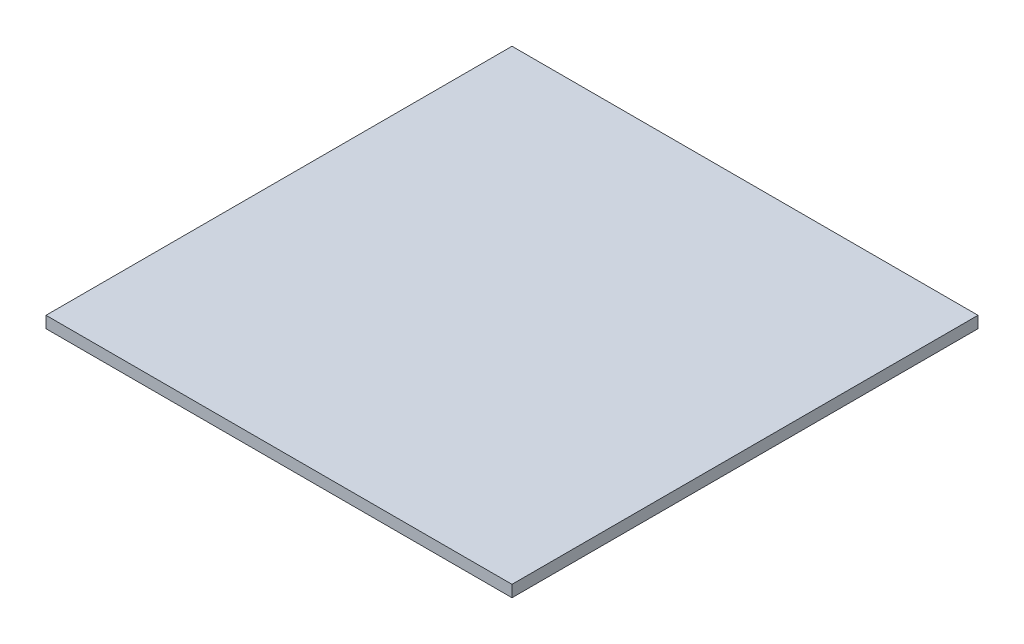
ISO-10303-21;
HEADER;
FILE_DESCRIPTION(('STEP AP214'),'2;1');
FILE_NAME('part.step','',(''),(''),'','','');
FILE_SCHEMA(('AUTOMOTIVE_DESIGN { 1 0 10303 214 1 1 1 1 }'));
ENDSEC;
DATA;
#1=APPLICATION_CONTEXT('core data for automotive mechanical design processes');
#2=APPLICATION_PROTOCOL_DEFINITION('international standard','automotive_design',2000,#1);
#3=PRODUCT_CONTEXT('',#1,'mechanical');
#4=PRODUCT('Part','Part','',(#3));
#5=PRODUCT_RELATED_PRODUCT_CATEGORY('part','',(#4));
#6=PRODUCT_DEFINITION_FORMATION('','',#4);
#7=PRODUCT_DEFINITION_CONTEXT('part definition',#1,'design');
#8=PRODUCT_DEFINITION('design','',#6,#7);
#9=PRODUCT_DEFINITION_SHAPE('','',#8);
#10=(LENGTH_UNIT() NAMED_UNIT(*) SI_UNIT(.MILLI.,.METRE.));
#11=(NAMED_UNIT(*) PLANE_ANGLE_UNIT() SI_UNIT($,.RADIAN.));
#12=(NAMED_UNIT(*) SI_UNIT($,.STERADIAN.) SOLID_ANGLE_UNIT());
#13=UNCERTAINTY_MEASURE_WITH_UNIT(LENGTH_MEASURE(1.E-05),#10,'distance_accuracy_value','');
#14=(GEOMETRIC_REPRESENTATION_CONTEXT(3) GLOBAL_UNCERTAINTY_ASSIGNED_CONTEXT((#13)) GLOBAL_UNIT_ASSIGNED_CONTEXT((#10,
#11,#12)) REPRESENTATION_CONTEXT('',''));
#15=CARTESIAN_POINT('',(0.,0.,0.));
#16=DIRECTION('',(0.,0.,1.));
#17=DIRECTION('',(1.,0.,0.));
#18=AXIS2_PLACEMENT_3D('',#15,#16,#17);
#19=CARTESIAN_POINT('',(200.,-10.,200.));
#20=DIRECTION('',(1.,0.,0.));
#21=DIRECTION('',(0.,0.,-1.));
#22=AXIS2_PLACEMENT_3D('',#19,#20,#21);
#23=PLANE('',#22);
#24=DIRECTION('',(0.,0.,-1.));
#25=VECTOR('',#24,1.);
#26=CARTESIAN_POINT('',(200.,0.,200.));
#27=LINE('',#26,#25);
#28=CARTESIAN_POINT('',(200.,0.,200.));
#29=VERTEX_POINT('',#28);
#30=CARTESIAN_POINT('',(200.,0.,-200.));
#31=VERTEX_POINT('',#30);
#32=EDGE_CURVE('E109',#29,#31,#27,.T.);
#33=ORIENTED_EDGE('',*,*,#32,.F.);
#34=DIRECTION('',(0.,1.,0.));
#35=VECTOR('',#34,1.);
#36=CARTESIAN_POINT('',(200.,-10.,200.));
#37=LINE('',#36,#35);
#38=CARTESIAN_POINT('',(200.,-10.,200.));
#39=VERTEX_POINT('',#38);
#40=EDGE_CURVE('E11',#39,#29,#37,.T.);
#41=ORIENTED_EDGE('',*,*,#40,.F.);
#42=DIRECTION('',(0.,0.,-1.));
#43=VECTOR('',#42,1.);
#44=CARTESIAN_POINT('',(200.,-10.,200.));
#45=LINE('',#44,#43);
#46=CARTESIAN_POINT('',(200.,-10.,-200.));
#47=VERTEX_POINT('',#46);
#48=EDGE_CURVE('E101',#39,#47,#45,.T.);
#49=ORIENTED_EDGE('',*,*,#48,.T.);
#50=DIRECTION('',(0.,1.,0.));
#51=VECTOR('',#50,1.);
#52=CARTESIAN_POINT('',(200.,-10.,-200.));
#53=LINE('',#52,#51);
#54=EDGE_CURVE('E42',#47,#31,#53,.T.);
#55=ORIENTED_EDGE('',*,*,#54,.T.);
#56=EDGE_LOOP('',(#33,#41,#49,#55));
#57=FACE_BOUND('',#56,.T.);
#58=ADVANCED_FACE('F39',(#57),#23,.T.);
#59=CARTESIAN_POINT('',(-200.,-10.,200.));
#60=DIRECTION('',(0.,0.,1.));
#61=DIRECTION('',(1.,0.,0.));
#62=AXIS2_PLACEMENT_3D('',#59,#60,#61);
#63=PLANE('',#62);
#64=DIRECTION('',(1.,0.,0.));
#65=VECTOR('',#64,1.);
#66=CARTESIAN_POINT('',(-200.,0.,200.));
#67=LINE('',#66,#65);
#68=CARTESIAN_POINT('',(-200.,0.,200.));
#69=VERTEX_POINT('',#68);
#70=EDGE_CURVE('E104',#69,#29,#67,.T.);
#71=ORIENTED_EDGE('',*,*,#70,.F.);
#72=DIRECTION('',(0.,1.,0.));
#73=VECTOR('',#72,1.);
#74=CARTESIAN_POINT('',(-200.,-10.,200.));
#75=LINE('',#74,#73);
#76=CARTESIAN_POINT('',(-200.,-10.,200.));
#77=VERTEX_POINT('',#76);
#78=EDGE_CURVE('E49',#77,#69,#75,.T.);
#79=ORIENTED_EDGE('',*,*,#78,.F.);
#80=DIRECTION('',(1.,0.,0.));
#81=VECTOR('',#80,1.);
#82=CARTESIAN_POINT('',(-200.,-10.,200.));
#83=LINE('',#82,#81);
#84=EDGE_CURVE('E96',#77,#39,#83,.T.);
#85=ORIENTED_EDGE('',*,*,#84,.T.);
#86=ORIENTED_EDGE('',*,*,#40,.T.);
#87=EDGE_LOOP('',(#71,#79,#85,#86));
#88=FACE_BOUND('',#87,.T.);
#89=ADVANCED_FACE('F125',(#88),#63,.T.);
#90=CARTESIAN_POINT('',(-200.,-10.,200.));
#91=DIRECTION('',(-1.,0.,0.));
#92=DIRECTION('',(0.,0.,1.));
#93=AXIS2_PLACEMENT_3D('',#90,#91,#92);
#94=PLANE('',#93);
#95=DIRECTION('',(0.,0.,1.));
#96=VECTOR('',#95,1.);
#97=CARTESIAN_POINT('',(-200.,0.,200.));
#98=LINE('',#97,#96);
#99=CARTESIAN_POINT('',(-200.,0.,-200.));
#100=VERTEX_POINT('',#99);
#101=EDGE_CURVE('E90',#100,#69,#98,.T.);
#102=ORIENTED_EDGE('',*,*,#101,.F.);
#103=DIRECTION('',(0.,1.,0.));
#104=VECTOR('',#103,1.);
#105=CARTESIAN_POINT('',(-200.,-10.,-200.));
#106=LINE('',#105,#104);
#107=CARTESIAN_POINT('',(-200.,-10.,-200.));
#108=VERTEX_POINT('',#107);
#109=EDGE_CURVE('E85',#108,#100,#106,.T.);
#110=ORIENTED_EDGE('',*,*,#109,.F.);
#111=DIRECTION('',(0.,0.,1.));
#112=VECTOR('',#111,1.);
#113=CARTESIAN_POINT('',(-200.,-10.,200.));
#114=LINE('',#113,#112);
#115=EDGE_CURVE('E88',#108,#77,#114,.T.);
#116=ORIENTED_EDGE('',*,*,#115,.T.);
#117=ORIENTED_EDGE('',*,*,#78,.T.);
#118=EDGE_LOOP('',(#102,#110,#116,#117));
#119=FACE_BOUND('',#118,.T.);
#120=ADVANCED_FACE('F87',(#119),#94,.T.);
#121=CARTESIAN_POINT('',(-200.,-10.,-200.));
#122=DIRECTION('',(0.,0.,-1.));
#123=DIRECTION('',(-1.,0.,0.));
#124=AXIS2_PLACEMENT_3D('',#121,#122,#123);
#125=PLANE('',#124);
#126=DIRECTION('',(-1.,0.,0.));
#127=VECTOR('',#126,1.);
#128=CARTESIAN_POINT('',(-200.,0.,-200.));
#129=LINE('',#128,#127);
#130=EDGE_CURVE('E113',#31,#100,#129,.T.);
#131=ORIENTED_EDGE('',*,*,#130,.F.);
#132=ORIENTED_EDGE('',*,*,#54,.F.);
#133=DIRECTION('',(-1.,0.,0.));
#134=VECTOR('',#133,1.);
#135=CARTESIAN_POINT('',(-200.,-10.,-200.));
#136=LINE('',#135,#134);
#137=EDGE_CURVE('E95',#47,#108,#136,.T.);
#138=ORIENTED_EDGE('',*,*,#137,.T.);
#139=ORIENTED_EDGE('',*,*,#109,.T.);
#140=EDGE_LOOP('',(#131,#132,#138,#139));
#141=FACE_BOUND('',#140,.T.);
#142=ADVANCED_FACE('F99',(#141),#125,.T.);
#143=CARTESIAN_POINT('',(0.,-10.,0.));
#144=DIRECTION('',(0.,-1.,0.));
#145=DIRECTION('',(0.,0.,-1.));
#146=AXIS2_PLACEMENT_3D('',#143,#144,#145);
#147=PLANE('',#146);
#148=ORIENTED_EDGE('',*,*,#48,.F.);
#149=ORIENTED_EDGE('',*,*,#84,.F.);
#150=ORIENTED_EDGE('',*,*,#115,.F.);
#151=ORIENTED_EDGE('',*,*,#137,.F.);
#152=EDGE_LOOP('',(#148,#149,#150,#151));
#153=FACE_BOUND('',#152,.T.);
#154=ADVANCED_FACE('F94',(#153),#147,.T.);
#155=CARTESIAN_POINT('',(0.,0.,0.));
#156=DIRECTION('',(0.,-1.,0.));
#157=DIRECTION('',(0.,0.,-1.));
#158=AXIS2_PLACEMENT_3D('',#155,#156,#157);
#159=PLANE('',#158);
#160=ORIENTED_EDGE('',*,*,#32,.T.);
#161=ORIENTED_EDGE('',*,*,#130,.T.);
#162=ORIENTED_EDGE('',*,*,#101,.T.);
#163=ORIENTED_EDGE('',*,*,#70,.T.);
#164=EDGE_LOOP('',(#160,#161,#162,#163));
#165=FACE_BOUND('',#164,.T.);
#166=ADVANCED_FACE('F124',(#165),#159,.F.);
#167=CLOSED_SHELL('',(#58,#89,#120,#142,#154,#166));
#168=MANIFOLD_SOLID_BREP('B2',#167);
#169=ADVANCED_BREP_SHAPE_REPRESENTATION('',(#18,#168),#14);
#170=SHAPE_DEFINITION_REPRESENTATION(#9,#169);
ENDSEC;
END-ISO-10303-21;
